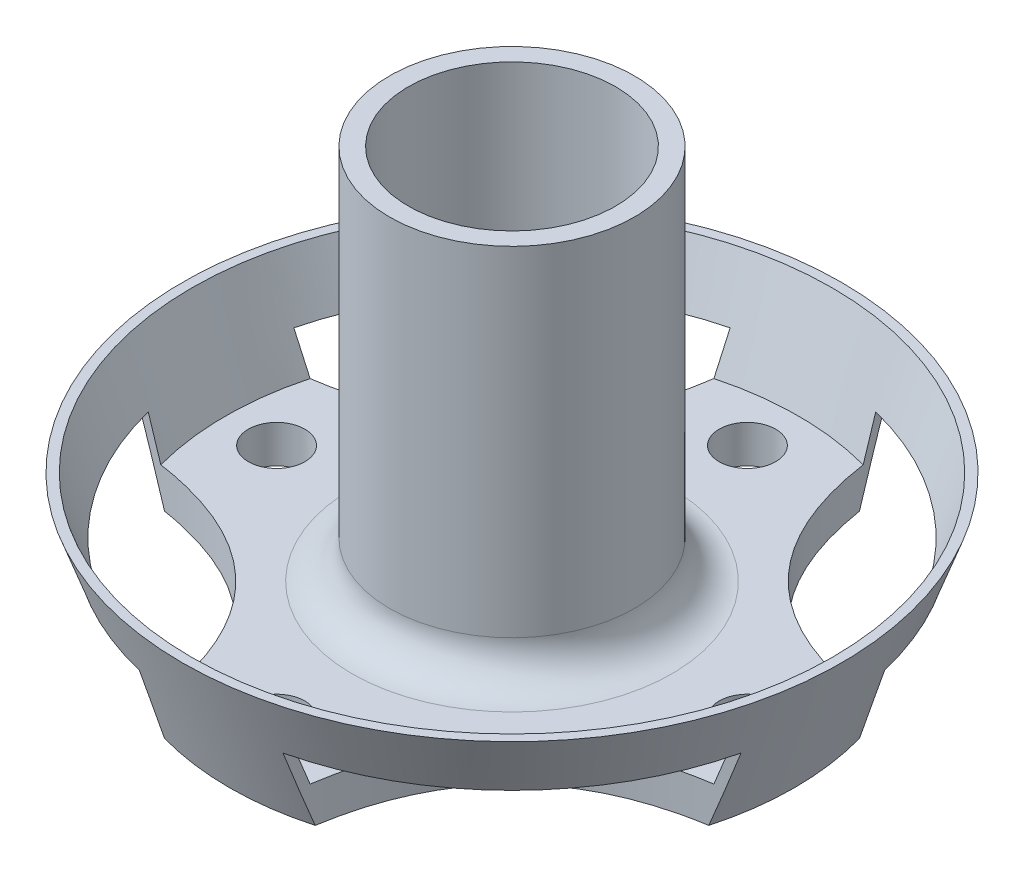
ISO-10303-21;
HEADER;
FILE_DESCRIPTION(('STEP AP214'),'2;1');
FILE_NAME('part.step','',(''),(''),'','','');
FILE_SCHEMA(('AUTOMOTIVE_DESIGN { 1 0 10303 214 1 1 1 1 }'));
ENDSEC;
DATA;
#1=APPLICATION_CONTEXT('core data for automotive mechanical design processes');
#2=APPLICATION_PROTOCOL_DEFINITION('international standard','automotive_design',2000,#1);
#3=PRODUCT_CONTEXT('',#1,'mechanical');
#4=PRODUCT('Part','Part','',(#3));
#5=PRODUCT_RELATED_PRODUCT_CATEGORY('part','',(#4));
#6=PRODUCT_DEFINITION_FORMATION('','',#4);
#7=PRODUCT_DEFINITION_CONTEXT('part definition',#1,'design');
#8=PRODUCT_DEFINITION('design','',#6,#7);
#9=PRODUCT_DEFINITION_SHAPE('','',#8);
#10=(LENGTH_UNIT() NAMED_UNIT(*) SI_UNIT(.MILLI.,.METRE.));
#11=(NAMED_UNIT(*) PLANE_ANGLE_UNIT() SI_UNIT($,.RADIAN.));
#12=(NAMED_UNIT(*) SI_UNIT($,.STERADIAN.) SOLID_ANGLE_UNIT());
#13=UNCERTAINTY_MEASURE_WITH_UNIT(LENGTH_MEASURE(1.E-05),#10,'distance_accuracy_value','');
#14=(GEOMETRIC_REPRESENTATION_CONTEXT(3) GLOBAL_UNCERTAINTY_ASSIGNED_CONTEXT((#13)) GLOBAL_UNIT_ASSIGNED_CONTEXT((#10,
#11,#12)) REPRESENTATION_CONTEXT('',''));
#15=CARTESIAN_POINT('',(0.,0.,0.));
#16=DIRECTION('',(0.,0.,1.));
#17=DIRECTION('',(1.,0.,0.));
#18=AXIS2_PLACEMENT_3D('',#15,#16,#17);
#19=CARTESIAN_POINT('',(0.,0.,0.));
#20=DIRECTION('',(0.,1.,0.));
#21=DIRECTION('',(0.,0.,1.));
#22=AXIS2_PLACEMENT_3D('',#19,#20,#21);
#23=CONICAL_SURFACE('',#22,17.5,0.343829862642884);
#24=CARTESIAN_POINT('',(14.4502302622862,-7.,4.));
#25=CARTESIAN_POINT('',(14.5363517533825,-6.77845174881383,3.98622296899141));
#26=CARTESIAN_POINT('',(14.62221347419,-6.5567631907813,3.97308695822821));
#27=CARTESIAN_POINT('',(14.7934567957451,-6.11314524514792,3.94803354015452));
#28=CARTESIAN_POINT('',(14.8788384214385,-5.89121587078824,3.93611606896538));
#29=CARTESIAN_POINT('',(15.04916804079,-5.44713793363533,3.91343512189331));
#30=CARTESIAN_POINT('',(15.1341160443688,-5.22498937599673,3.90267161949545));
#31=CARTESIAN_POINT('',(15.3036172647662,-4.7804922970567,3.88224231829451));
#32=CARTESIAN_POINT('',(15.3881704830445,-4.55814377649821,3.87257651542989));
#33=CARTESIAN_POINT('',(15.556918188404,-4.11326101691808,3.85429076300149));
#34=CARTESIAN_POINT('',(15.6411126658541,-3.89072677309978,3.84567084134774));
#35=CARTESIAN_POINT('',(15.8091733992056,-3.44548570683477,3.8294309358519));
#36=CARTESIAN_POINT('',(15.8930396392242,-3.22277887664665,3.82181099983058));
#37=CARTESIAN_POINT('',(15.9767541277314,-3.,3.81466835778894));
#38=B_SPLINE_CURVE_WITH_KNOTS('',3,(#24,#25,#26,#27,#28,#29,#30,#31,#32,#33,#34,#35,#36,#37),
.UNSPECIFIED.,.F.,.F.,(4,2,2,2,2,2,4),(0.,0.714290260718048,1.42854305747876,2.14277943922262,
2.85701317818078,3.57126597275118,4.28555291149746),.UNSPECIFIED.);
#39=CARTESIAN_POINT('',(14.4502302622826,-7.,4.00000000000057));
#40=VERTEX_POINT('',#39);
#41=CARTESIAN_POINT('',(15.9767541277313,-3.,3.81466835778894));
#42=VERTEX_POINT('',#41);
#43=EDGE_CURVE('E339',#40,#42,#38,.T.);
#44=ORIENTED_EDGE('',*,*,#43,.F.);
#45=CARTESIAN_POINT('',(0.,-7.,0.));
#46=DIRECTION('',(0.,1.,0.));
#47=DIRECTION('',(0.,0.,1.));
#48=AXIS2_PLACEMENT_3D('',#45,#46,#47);
#49=CIRCLE('',#48,14.993637138236);
#50=CARTESIAN_POINT('',(14.4502302622826,-7.,-4.00000000000057));
#51=VERTEX_POINT('',#50);
#52=EDGE_CURVE('E193',#40,#51,#49,.T.);
#53=ORIENTED_EDGE('',*,*,#52,.T.);
#54=CARTESIAN_POINT('',(14.4502302622862,-7.,-4.));
#55=CARTESIAN_POINT('',(14.5363517533825,-6.77845174881383,-3.98622296899141));
#56=CARTESIAN_POINT('',(14.62221347419,-6.5567631907813,-3.97308695822821));
#57=CARTESIAN_POINT('',(14.7934567957451,-6.11314524514792,-3.94803354015452));
#58=CARTESIAN_POINT('',(14.8788384214385,-5.89121587078824,-3.93611606896538));
#59=CARTESIAN_POINT('',(15.04916804079,-5.44713793363533,-3.91343512189331));
#60=CARTESIAN_POINT('',(15.1341160443688,-5.22498937599673,-3.90267161949545));
#61=CARTESIAN_POINT('',(15.3036172647662,-4.7804922970567,-3.88224231829451));
#62=CARTESIAN_POINT('',(15.3881704830445,-4.55814377649821,-3.87257651542989));
#63=CARTESIAN_POINT('',(15.556918188404,-4.11326101691808,-3.85429076300149));
#64=CARTESIAN_POINT('',(15.6411126658541,-3.89072677309978,-3.84567084134774));
#65=CARTESIAN_POINT('',(15.8091733992056,-3.44548570683477,-3.8294309358519));
#66=CARTESIAN_POINT('',(15.8930396392242,-3.22277887664665,-3.82181099983058));
#67=CARTESIAN_POINT('',(15.9767541277314,-3.,-3.81466835778894));
#68=B_SPLINE_CURVE_WITH_KNOTS('',3,(#54,#55,#56,#57,#58,#59,#60,#61,#62,#63,#64,#65,#66,#67),
.UNSPECIFIED.,.F.,.F.,(4,2,2,2,2,2,4),(0.,0.714290260718048,1.42854305747876,2.14277943922262,
2.85701317818078,3.57126597275118,4.28555291149746),.UNSPECIFIED.);
#69=CARTESIAN_POINT('',(15.9767541277313,-3.,-3.81466835778894));
#70=VERTEX_POINT('',#69);
#71=EDGE_CURVE('E288',#51,#70,#68,.T.);
#72=ORIENTED_EDGE('',*,*,#71,.T.);
#73=CARTESIAN_POINT('',(0.,-3.,0.));
#74=DIRECTION('',(0.,-1.,0.));
#75=DIRECTION('',(0.,0.,-1.));
#76=AXIS2_PLACEMENT_3D('',#73,#74,#75);
#77=CIRCLE('',#76,16.4258444878154);
#78=CARTESIAN_POINT('',(3.81466835778894,-3.,-15.9767541277313));
#79=VERTEX_POINT('',#78);
#80=EDGE_CURVE('E437',#70,#79,#77,.F.);
#81=ORIENTED_EDGE('',*,*,#80,.T.);
#82=CARTESIAN_POINT('',(3.81466835778894,-3.,-15.9767541277313));
#83=CARTESIAN_POINT('',(3.82181099983058,-3.22277887664664,-15.8930396392242));
#84=CARTESIAN_POINT('',(3.8294309358519,-3.44548570683477,-15.8091733992056));
#85=CARTESIAN_POINT('',(3.84567084134774,-3.89072677309978,-15.6411126658541));
#86=CARTESIAN_POINT('',(3.8542907630015,-4.11326101691808,-15.556918188404));
#87=CARTESIAN_POINT('',(3.8725765154299,-4.5581437764982,-15.3881704830445));
#88=CARTESIAN_POINT('',(3.88224231829451,-4.7804922970567,-15.3036172647662));
#89=CARTESIAN_POINT('',(3.90267161949545,-5.22498937599673,-15.1341160443688));
#90=CARTESIAN_POINT('',(3.91343512189331,-5.44713793363533,-15.04916804079));
#91=CARTESIAN_POINT('',(3.93611606896538,-5.89121587078824,-14.8788384214385));
#92=CARTESIAN_POINT('',(3.94803354015452,-6.11314524514792,-14.7934567957452));
#93=CARTESIAN_POINT('',(3.97308695822821,-6.5567631907813,-14.62221347419));
#94=CARTESIAN_POINT('',(3.98622296899141,-6.77845174881383,-14.5363517533825));
#95=CARTESIAN_POINT('',(4.,-7.,-14.4502302622862));
#96=B_SPLINE_CURVE_WITH_KNOTS('',3,(#82,#83,#84,#85,#86,#87,#88,#89,#90,#91,#92,#93,#94,#95),
.UNSPECIFIED.,.F.,.F.,(4,2,2,2,2,2,4),(0.,0.714286938746281,1.42853973331668,2.14277347227484,
2.8570098540187,3.57126265077941,4.28555291149746),.UNSPECIFIED.);
#97=CARTESIAN_POINT('',(3.99999999999997,-7.,-14.4502302622864));
#98=VERTEX_POINT('',#97);
#99=EDGE_CURVE('E220',#79,#98,#96,.T.);
#100=ORIENTED_EDGE('',*,*,#99,.T.);
#101=CARTESIAN_POINT('',(-3.99999999999997,-7.,-14.4502302622864));
#102=VERTEX_POINT('',#101);
#103=EDGE_CURVE('E200',#98,#102,#49,.T.);
#104=ORIENTED_EDGE('',*,*,#103,.T.);
#105=CARTESIAN_POINT('',(-3.81466835778894,-3.,-15.9767541277313));
#106=CARTESIAN_POINT('',(-3.82181099983058,-3.22277887664664,-15.8930396392242));
#107=CARTESIAN_POINT('',(-3.8294309358519,-3.44548570683477,-15.8091733992056));
#108=CARTESIAN_POINT('',(-3.84567084134774,-3.89072677309978,-15.6411126658541));
#109=CARTESIAN_POINT('',(-3.8542907630015,-4.11326101691808,-15.556918188404));
#110=CARTESIAN_POINT('',(-3.8725765154299,-4.5581437764982,-15.3881704830445));
#111=CARTESIAN_POINT('',(-3.88224231829451,-4.7804922970567,-15.3036172647662));
#112=CARTESIAN_POINT('',(-3.90267161949545,-5.22498937599673,-15.1341160443688));
#113=CARTESIAN_POINT('',(-3.91343512189331,-5.44713793363533,-15.04916804079));
#114=CARTESIAN_POINT('',(-3.93611606896538,-5.89121587078824,-14.8788384214385));
#115=CARTESIAN_POINT('',(-3.94803354015452,-6.11314524514792,-14.7934567957452));
#116=CARTESIAN_POINT('',(-3.97308695822821,-6.5567631907813,-14.62221347419));
#117=CARTESIAN_POINT('',(-3.98622296899141,-6.77845174881383,-14.5363517533825));
#118=CARTESIAN_POINT('',(-4.,-7.,-14.4502302622862));
#119=B_SPLINE_CURVE_WITH_KNOTS('',3,(#105,#106,#107,#108,#109,#110,#111,#112,#113,#114,#115,
#116,#117,#118),.UNSPECIFIED.,.F.,.F.,(4,2,2,2,2,2,4),(0.,0.714286938746281,1.42853973331668,
2.14277347227484,2.8570098540187,3.57126265077941,4.28555291149746),.UNSPECIFIED.);
#120=CARTESIAN_POINT('',(-3.81466835778894,-3.,-15.9767541277313));
#121=VERTEX_POINT('',#120);
#122=EDGE_CURVE('E212',#121,#102,#119,.T.);
#123=ORIENTED_EDGE('',*,*,#122,.F.);
#124=CARTESIAN_POINT('',(0.,-3.,0.));
#125=DIRECTION('',(0.,-1.,0.));
#126=DIRECTION('',(0.,0.,-1.));
#127=AXIS2_PLACEMENT_3D('',#124,#125,#126);
#128=CIRCLE('',#127,16.4258444878154);
#129=CARTESIAN_POINT('',(-15.9767541277313,-3.,-3.81466835778894));
#130=VERTEX_POINT('',#129);
#131=EDGE_CURVE('E531',#121,#130,#128,.F.);
#132=ORIENTED_EDGE('',*,*,#131,.T.);
#133=CARTESIAN_POINT('',(-14.4502302622862,-7.,-4.));
#134=CARTESIAN_POINT('',(-14.5363517533825,-6.77845174881383,-3.98622296899141));
#135=CARTESIAN_POINT('',(-14.62221347419,-6.5567631907813,-3.97308695822821));
#136=CARTESIAN_POINT('',(-14.7934567957451,-6.11314524514792,-3.94803354015452));
#137=CARTESIAN_POINT('',(-14.8788384214385,-5.89121587078824,-3.93611606896538));
#138=CARTESIAN_POINT('',(-15.04916804079,-5.44713793363533,-3.91343512189331));
#139=CARTESIAN_POINT('',(-15.1341160443688,-5.22498937599673,-3.90267161949545));
#140=CARTESIAN_POINT('',(-15.3036172647662,-4.7804922970567,-3.88224231829451));
#141=CARTESIAN_POINT('',(-15.3881704830445,-4.55814377649821,-3.87257651542989));
#142=CARTESIAN_POINT('',(-15.556918188404,-4.11326101691808,-3.85429076300149));
#143=CARTESIAN_POINT('',(-15.6411126658541,-3.89072677309978,-3.84567084134774));
#144=CARTESIAN_POINT('',(-15.8091733992056,-3.44548570683477,-3.8294309358519));
#145=CARTESIAN_POINT('',(-15.8930396392242,-3.22277887664665,-3.82181099983058));
#146=CARTESIAN_POINT('',(-15.9767541277314,-3.,-3.81466835778894));
#147=B_SPLINE_CURVE_WITH_KNOTS('',3,(#133,#134,#135,#136,#137,#138,#139,#140,#141,#142,#143,
#144,#145,#146),.UNSPECIFIED.,.F.,.F.,(4,2,2,2,2,2,4),(0.,0.714290260718048,1.42854305747876,
2.14277943922262,2.85701317818078,3.57126597275118,4.28555291149746),.UNSPECIFIED.);
#148=CARTESIAN_POINT('',(-14.4502302622826,-7.,-4.00000000000057));
#149=VERTEX_POINT('',#148);
#150=EDGE_CURVE('E322',#149,#130,#147,.T.);
#151=ORIENTED_EDGE('',*,*,#150,.F.);
#152=CARTESIAN_POINT('',(-14.4502302622826,-7.,4.00000000000057));
#153=VERTEX_POINT('',#152);
#154=EDGE_CURVE('E194',#149,#153,#49,.T.);
#155=ORIENTED_EDGE('',*,*,#154,.T.);
#156=CARTESIAN_POINT('',(-14.4502302622862,-7.,4.));
#157=CARTESIAN_POINT('',(-14.5363517533825,-6.77845174881383,3.98622296899141));
#158=CARTESIAN_POINT('',(-14.62221347419,-6.5567631907813,3.97308695822821));
#159=CARTESIAN_POINT('',(-14.7934567957451,-6.11314524514792,3.94803354015452));
#160=CARTESIAN_POINT('',(-14.8788384214385,-5.89121587078824,3.93611606896538));
#161=CARTESIAN_POINT('',(-15.04916804079,-5.44713793363533,3.91343512189331));
#162=CARTESIAN_POINT('',(-15.1341160443688,-5.22498937599673,3.90267161949545));
#163=CARTESIAN_POINT('',(-15.3036172647662,-4.7804922970567,3.88224231829451));
#164=CARTESIAN_POINT('',(-15.3881704830445,-4.55814377649821,3.87257651542989));
#165=CARTESIAN_POINT('',(-15.556918188404,-4.11326101691808,3.85429076300149));
#166=CARTESIAN_POINT('',(-15.6411126658541,-3.89072677309978,3.84567084134774));
#167=CARTESIAN_POINT('',(-15.8091733992056,-3.44548570683477,3.8294309358519));
#168=CARTESIAN_POINT('',(-15.8930396392242,-3.22277887664665,3.82181099983058));
#169=CARTESIAN_POINT('',(-15.9767541277314,-3.,3.81466835778894));
#170=B_SPLINE_CURVE_WITH_KNOTS('',3,(#156,#157,#158,#159,#160,#161,#162,#163,#164,#165,#166,
#167,#168,#169),.UNSPECIFIED.,.F.,.F.,(4,2,2,2,2,2,4),(0.,0.714290260718049,1.42854305747876,
2.14277943922262,2.85701317818078,3.57126597275118,4.28555291149746),.UNSPECIFIED.);
#171=CARTESIAN_POINT('',(-15.9767541277313,-3.,3.81466835778894));
#172=VERTEX_POINT('',#171);
#173=EDGE_CURVE('E170',#153,#172,#170,.T.);
#174=ORIENTED_EDGE('',*,*,#173,.T.);
#175=CARTESIAN_POINT('',(0.,-3.,0.));
#176=DIRECTION('',(0.,-1.,0.));
#177=DIRECTION('',(0.,0.,-1.));
#178=AXIS2_PLACEMENT_3D('',#175,#176,#177);
#179=CIRCLE('',#178,16.4258444878154);
#180=CARTESIAN_POINT('',(-3.81466835778894,-3.,15.9767541277313));
#181=VERTEX_POINT('',#180);
#182=EDGE_CURVE('E185',#172,#181,#179,.F.);
#183=ORIENTED_EDGE('',*,*,#182,.T.);
#184=CARTESIAN_POINT('',(-3.81466835778894,-3.,15.9767541277313));
#185=CARTESIAN_POINT('',(-3.82181099983058,-3.22277887664664,15.8930396392242));
#186=CARTESIAN_POINT('',(-3.8294309358519,-3.44548570683477,15.8091733992056));
#187=CARTESIAN_POINT('',(-3.84567084134774,-3.89072677309978,15.6411126658541));
#188=CARTESIAN_POINT('',(-3.8542907630015,-4.11326101691808,15.556918188404));
#189=CARTESIAN_POINT('',(-3.8725765154299,-4.5581437764982,15.3881704830445));
#190=CARTESIAN_POINT('',(-3.88224231829451,-4.7804922970567,15.3036172647662));
#191=CARTESIAN_POINT('',(-3.90267161949545,-5.22498937599673,15.1341160443688));
#192=CARTESIAN_POINT('',(-3.91343512189331,-5.44713793363533,15.04916804079));
#193=CARTESIAN_POINT('',(-3.93611606896538,-5.89121587078824,14.8788384214385));
#194=CARTESIAN_POINT('',(-3.94803354015452,-6.11314524514792,14.7934567957452));
#195=CARTESIAN_POINT('',(-3.97308695822821,-6.5567631907813,14.62221347419));
#196=CARTESIAN_POINT('',(-3.98622296899141,-6.77845174881383,14.5363517533825));
#197=CARTESIAN_POINT('',(-4.,-7.,14.4502302622862));
#198=B_SPLINE_CURVE_WITH_KNOTS('',3,(#184,#185,#186,#187,#188,#189,#190,#191,#192,#193,#194,
#195,#196,#197),.UNSPECIFIED.,.F.,.F.,(4,2,2,2,2,2,4),(0.,0.714286938746281,1.42853973331668,
2.14277347227484,2.8570098540187,3.57126265077941,4.28555291149746),.UNSPECIFIED.);
#199=CARTESIAN_POINT('',(-3.99999999999997,-7.,14.4502302622864));
#200=VERTEX_POINT('',#199);
#201=EDGE_CURVE('E161',#181,#200,#198,.T.);
#202=ORIENTED_EDGE('',*,*,#201,.T.);
#203=CARTESIAN_POINT('',(3.99999999999997,-7.,14.4502302622864));
#204=VERTEX_POINT('',#203);
#205=EDGE_CURVE('E181',#200,#204,#49,.T.);
#206=ORIENTED_EDGE('',*,*,#205,.T.);
#207=CARTESIAN_POINT('',(3.81466835778894,-3.,15.9767541277313));
#208=CARTESIAN_POINT('',(3.82181099983058,-3.22277887664664,15.8930396392242));
#209=CARTESIAN_POINT('',(3.8294309358519,-3.44548570683477,15.8091733992056));
#210=CARTESIAN_POINT('',(3.84567084134774,-3.89072677309978,15.6411126658541));
#211=CARTESIAN_POINT('',(3.8542907630015,-4.11326101691808,15.556918188404));
#212=CARTESIAN_POINT('',(3.8725765154299,-4.5581437764982,15.3881704830445));
#213=CARTESIAN_POINT('',(3.88224231829451,-4.7804922970567,15.3036172647662));
#214=CARTESIAN_POINT('',(3.90267161949545,-5.22498937599673,15.1341160443688));
#215=CARTESIAN_POINT('',(3.91343512189331,-5.44713793363533,15.04916804079));
#216=CARTESIAN_POINT('',(3.93611606896538,-5.89121587078824,14.8788384214385));
#217=CARTESIAN_POINT('',(3.94803354015452,-6.11314524514792,14.7934567957452));
#218=CARTESIAN_POINT('',(3.97308695822821,-6.5567631907813,14.62221347419));
#219=CARTESIAN_POINT('',(3.98622296899141,-6.77845174881383,14.5363517533825));
#220=CARTESIAN_POINT('',(4.,-7.,14.4502302622862));
#221=B_SPLINE_CURVE_WITH_KNOTS('',3,(#207,#208,#209,#210,#211,#212,#213,#214,#215,#216,#217,
#218,#219,#220),.UNSPECIFIED.,.F.,.F.,(4,2,2,2,2,2,4),(0.,0.714286938746281,1.42853973331668,
2.14277347227484,2.8570098540187,3.57126265077941,4.28555291149746),.UNSPECIFIED.);
#222=CARTESIAN_POINT('',(3.81466835778894,-3.,15.9767541277313));
#223=VERTEX_POINT('',#222);
#224=EDGE_CURVE('E335',#223,#204,#221,.T.);
#225=ORIENTED_EDGE('',*,*,#224,.F.);
#226=CARTESIAN_POINT('',(0.,-3.,0.));
#227=DIRECTION('',(0.,-1.,0.));
#228=DIRECTION('',(0.,0.,-1.));
#229=AXIS2_PLACEMENT_3D('',#226,#227,#228);
#230=CIRCLE('',#229,16.4258444878154);
#231=EDGE_CURVE('E523',#223,#42,#230,.F.);
#232=ORIENTED_EDGE('',*,*,#231,.T.);
#233=EDGE_LOOP('',(#44,#53,#72,#81,#100,#104,#123,#132,#151,#155,#174,#183,#202,#206,#225,#232));
#234=FACE_BOUND('',#233,.T.);
#235=CARTESIAN_POINT('',(0.,0.,0.));
#236=DIRECTION('',(0.,1.,0.));
#237=DIRECTION('',(0.,0.,1.));
#238=AXIS2_PLACEMENT_3D('',#235,#236,#237);
#239=CIRCLE('',#238,17.5);
#240=CARTESIAN_POINT('',(0.,0.,17.5));
#241=VERTEX_POINT('',#240);
#242=EDGE_CURVE('E191',#241,#241,#239,.T.);
#243=ORIENTED_EDGE('',*,*,#242,.F.);
#244=EDGE_LOOP('',(#243));
#245=FACE_BOUND('',#244,.T.);
#246=ADVANCED_FACE('F44',(#234,#245),#23,.T.);
#247=CARTESIAN_POINT('',(0.,-7.,0.));
#248=DIRECTION('',(0.,1.,0.));
#249=DIRECTION('',(0.,0.,1.));
#250=AXIS2_PLACEMENT_3D('',#247,#248,#249);
#251=PLANE('',#250);
#252=CARTESIAN_POINT('',(-12.5,-7.,0.));
#253=DIRECTION('',(0.,-1.,0.));
#254=DIRECTION('',(0.,0.,-1.));
#255=AXIS2_PLACEMENT_3D('',#252,#253,#254);
#256=CIRCLE('',#255,1.5);
#257=CARTESIAN_POINT('',(-12.5,-7.,-1.5));
#258=VERTEX_POINT('',#257);
#259=EDGE_CURVE('E464',#258,#258,#256,.T.);
#260=ORIENTED_EDGE('',*,*,#259,.F.);
#261=EDGE_LOOP('',(#260));
#262=FACE_BOUND('',#261,.T.);
#263=CARTESIAN_POINT('',(0.,-7.,12.5));
#264=DIRECTION('',(0.,-1.,0.));
#265=DIRECTION('',(0.,0.,-1.));
#266=AXIS2_PLACEMENT_3D('',#263,#264,#265);
#267=CIRCLE('',#266,1.5);
#268=CARTESIAN_POINT('',(0.,-7.,11.));
#269=VERTEX_POINT('',#268);
#270=EDGE_CURVE('E546',#269,#269,#267,.T.);
#271=ORIENTED_EDGE('',*,*,#270,.F.);
#272=EDGE_LOOP('',(#271));
#273=FACE_BOUND('',#272,.T.);
#274=CARTESIAN_POINT('',(12.5,-7.,0.));
#275=DIRECTION('',(0.,-1.,0.));
#276=DIRECTION('',(0.,0.,-1.));
#277=AXIS2_PLACEMENT_3D('',#274,#275,#276);
#278=CIRCLE('',#277,1.5);
#279=CARTESIAN_POINT('',(12.5,-7.,-1.5));
#280=VERTEX_POINT('',#279);
#281=EDGE_CURVE('E549',#280,#280,#278,.T.);
#282=ORIENTED_EDGE('',*,*,#281,.F.);
#283=EDGE_LOOP('',(#282));
#284=FACE_BOUND('',#283,.T.);
#285=CARTESIAN_POINT('',(0.,-7.,-12.5));
#286=DIRECTION('',(0.,-1.,0.));
#287=DIRECTION('',(0.,0.,-1.));
#288=AXIS2_PLACEMENT_3D('',#285,#286,#287);
#289=CIRCLE('',#288,1.5);
#290=CARTESIAN_POINT('',(0.,-7.,-14.));
#291=VERTEX_POINT('',#290);
#292=EDGE_CURVE('E555',#291,#291,#289,.T.);
#293=ORIENTED_EDGE('',*,*,#292,.F.);
#294=EDGE_LOOP('',(#293));
#295=FACE_BOUND('',#294,.T.);
#296=CARTESIAN_POINT('',(0.,-7.,0.));
#297=DIRECTION('',(0.,-1.,0.));
#298=DIRECTION('',(0.,0.,-1.));
#299=AXIS2_PLACEMENT_3D('',#296,#297,#298);
#300=CIRCLE('',#299,5.5);
#301=CARTESIAN_POINT('',(0.,-7.,-5.5));
#302=VERTEX_POINT('',#301);
#303=EDGE_CURVE('E375',#302,#302,#300,.T.);
#304=ORIENTED_EDGE('',*,*,#303,.F.);
#305=EDGE_LOOP('',(#304));
#306=FACE_BOUND('',#305,.T.);
#307=CARTESIAN_POINT('',(3.74578755544739,-7.,17.0944165033339));
#308=CARTESIAN_POINT('',(4.2463071276076,-7.,4.24630712760761));
#309=CARTESIAN_POINT('',(17.0944165033339,-7.,3.74578755544738));
#310=B_SPLINE_CURVE_WITH_KNOTS('',2,(#307,#308,#309),.UNSPECIFIED.,.F.,.F.,(3,3),(0.,1.),.UNSPECIFIED.);
#311=EDGE_CURVE('E186',#204,#40,#310,.T.);
#312=ORIENTED_EDGE('',*,*,#311,.F.);
#313=ORIENTED_EDGE('',*,*,#205,.F.);
#314=CARTESIAN_POINT('',(-3.74578755544739,-7.,17.0944165033339));
#315=CARTESIAN_POINT('',(-4.2463071276076,-7.,4.24630712760761));
#316=CARTESIAN_POINT('',(-17.0944165033339,-7.,3.74578755544738));
#317=B_SPLINE_CURVE_WITH_KNOTS('',2,(#314,#315,#316),.UNSPECIFIED.,.F.,.F.,(3,3),(0.,1.),.UNSPECIFIED.);
#318=EDGE_CURVE('E158',#200,#153,#317,.T.);
#319=ORIENTED_EDGE('',*,*,#318,.T.);
#320=ORIENTED_EDGE('',*,*,#154,.F.);
#321=CARTESIAN_POINT('',(-3.74578755544739,-7.,-17.0944165033339));
#322=CARTESIAN_POINT('',(-4.2463071276076,-7.,-4.24630712760761));
#323=CARTESIAN_POINT('',(-17.0944165033339,-7.,-3.74578755544738));
#324=B_SPLINE_CURVE_WITH_KNOTS('',2,(#321,#322,#323),.UNSPECIFIED.,.F.,.F.,(3,3),(0.,1.),.UNSPECIFIED.);
#325=EDGE_CURVE('E221',#102,#149,#324,.T.);
#326=ORIENTED_EDGE('',*,*,#325,.F.);
#327=ORIENTED_EDGE('',*,*,#103,.F.);
#328=CARTESIAN_POINT('',(3.74578755544739,-7.,-17.0944165033339));
#329=CARTESIAN_POINT('',(4.2463071276076,-7.,-4.24630712760761));
#330=CARTESIAN_POINT('',(17.0944165033339,-7.,-3.74578755544738));
#331=B_SPLINE_CURVE_WITH_KNOTS('',2,(#328,#329,#330),.UNSPECIFIED.,.F.,.F.,(3,3),(0.,1.),.UNSPECIFIED.);
#332=EDGE_CURVE('E218',#98,#51,#331,.T.);
#333=ORIENTED_EDGE('',*,*,#332,.T.);
#334=ORIENTED_EDGE('',*,*,#52,.F.);
#335=EDGE_LOOP('',(#312,#313,#319,#320,#326,#327,#333,#334));
#336=FACE_BOUND('',#335,.T.);
#337=ADVANCED_FACE('F190',(#262,#273,#284,#295,#306,#336),#251,.F.);
#338=CARTESIAN_POINT('',(0.,0.,0.));
#339=DIRECTION('',(0.,1.,0.));
#340=DIRECTION('',(0.,0.,1.));
#341=AXIS2_PLACEMENT_3D('',#338,#339,#340);
#342=CONICAL_SURFACE('',#341,17.,0.343829862642884);
#343=CARTESIAN_POINT('',(0.,-5.,0.));
#344=DIRECTION('',(0.,1.,0.));
#345=DIRECTION('',(0.,0.,1.));
#346=AXIS2_PLACEMENT_3D('',#343,#344,#345);
#347=CIRCLE('',#346,15.2097408130257);
#348=CARTESIAN_POINT('',(14.6840911671301,-5.,3.96404871246978));
#349=VERTEX_POINT('',#348);
#350=CARTESIAN_POINT('',(14.6840911671271,-5.,-3.96404871246898));
#351=VERTEX_POINT('',#350);
#352=EDGE_CURVE('E196',#349,#351,#347,.T.);
#353=ORIENTED_EDGE('',*,*,#352,.F.);
#354=CARTESIAN_POINT('',(14.6840911671304,-5.,3.96404871246849));
#355=CARTESIAN_POINT('',(14.7483677576832,-4.8335886137216,3.95456558985454));
#356=CARTESIAN_POINT('',(14.8125099997946,-4.66710589560705,3.94542615524612));
#357=CARTESIAN_POINT('',(14.9405420773175,-4.33401126478599,3.92780928189622));
#358=CARTESIAN_POINT('',(15.0044319164792,-4.16739935404343,3.91933183328322));
#359=CARTESIAN_POINT('',(15.131977374195,-3.83405489574011,3.90301327303525));
#360=CARTESIAN_POINT('',(15.195632992824,-3.66732234821798,3.89517216119659));
#361=CARTESIAN_POINT('',(15.3227259525316,-3.33374350665749,3.88010337825631));
#362=CARTESIAN_POINT('',(15.3861632903405,-3.16689721095968,3.87287571630595));
#363=CARTESIAN_POINT('',(15.4494984998934,-3.0000000000002,3.86594344912986));
#364=B_SPLINE_CURVE_WITH_KNOTS('',3,(#354,#355,#356,#357,#358,#359,#360,#361,#362,#363),
.UNSPECIFIED.,.F.,.F.,(4,2,2,2,4),(0.,0.535935442902525,1.07186289241163,1.60779017038091,
2.14372544174616),.UNSPECIFIED.);
#365=CARTESIAN_POINT('',(15.4494984998929,-3.,3.86594344912991));
#366=VERTEX_POINT('',#365);
#367=EDGE_CURVE('E338',#349,#366,#364,.T.);
#368=ORIENTED_EDGE('',*,*,#367,.T.);
#369=CARTESIAN_POINT('',(0.,-3.,0.));
#370=DIRECTION('',(0.,-1.,0.));
#371=DIRECTION('',(0.,0.,-1.));
#372=AXIS2_PLACEMENT_3D('',#369,#370,#371);
#373=CIRCLE('',#372,15.9258444878154);
#374=CARTESIAN_POINT('',(3.86594344912985,-3.,15.4494984998935));
#375=VERTEX_POINT('',#374);
#376=EDGE_CURVE('E448',#375,#366,#373,.F.);
#377=ORIENTED_EDGE('',*,*,#376,.F.);
#378=CARTESIAN_POINT('',(3.86594344912985,-3.,15.4494984998935));
#379=CARTESIAN_POINT('',(3.87287571630594,-3.16689721095949,15.3861632903405));
#380=CARTESIAN_POINT('',(3.88010337825631,-3.33374350665732,15.3227259525317));
#381=CARTESIAN_POINT('',(3.89517216119659,-3.66732234821785,15.195632992824));
#382=CARTESIAN_POINT('',(3.90301327303524,-3.83405489573999,15.1319773741951));
#383=CARTESIAN_POINT('',(3.91933183328322,-4.16739935404334,15.0044319164793));
#384=CARTESIAN_POINT('',(3.92780928189622,-4.33401126478592,14.9405420773175));
#385=CARTESIAN_POINT('',(3.94542615524611,-4.66710589560702,14.8125099997946));
#386=CARTESIAN_POINT('',(3.95456558985454,-4.83358861372158,14.7483677576832));
#387=CARTESIAN_POINT('',(3.9640487124685,-5.,14.6840911671304));
#388=B_SPLINE_CURVE_WITH_KNOTS('',3,(#378,#379,#380,#381,#382,#383,#384,#385,#386,#387),
.UNSPECIFIED.,.F.,.F.,(4,2,2,2,4),(0.,0.535935271365306,1.07186254933464,1.6077899988438,
2.14372544174638),.UNSPECIFIED.);
#389=CARTESIAN_POINT('',(3.9640487124685,-5.,14.6840911671304));
#390=VERTEX_POINT('',#389);
#391=EDGE_CURVE('E428',#375,#390,#388,.T.);
#392=ORIENTED_EDGE('',*,*,#391,.T.);
#393=CARTESIAN_POINT('',(-3.9640487124685,-5.,14.6840911671304));
#394=VERTEX_POINT('',#393);
#395=EDGE_CURVE('E507',#394,#390,#347,.T.);
#396=ORIENTED_EDGE('',*,*,#395,.F.);
#397=CARTESIAN_POINT('',(-3.86594344912985,-3.,15.4494984998935));
#398=CARTESIAN_POINT('',(-3.87287571630594,-3.16689721095949,15.3861632903405));
#399=CARTESIAN_POINT('',(-3.88010337825631,-3.33374350665732,15.3227259525317));
#400=CARTESIAN_POINT('',(-3.89517216119659,-3.66732234821785,15.195632992824));
#401=CARTESIAN_POINT('',(-3.90301327303524,-3.83405489573999,15.1319773741951));
#402=CARTESIAN_POINT('',(-3.91933183328322,-4.16739935404335,15.0044319164793));
#403=CARTESIAN_POINT('',(-3.92780928189622,-4.33401126478592,14.9405420773175));
#404=CARTESIAN_POINT('',(-3.94542615524611,-4.66710589560702,14.8125099997946));
#405=CARTESIAN_POINT('',(-3.95456558985454,-4.83358861372158,14.7483677576832));
#406=CARTESIAN_POINT('',(-3.9640487124685,-5.,14.6840911671304));
#407=B_SPLINE_CURVE_WITH_KNOTS('',3,(#397,#398,#399,#400,#401,#402,#403,#404,#405,#406),
.UNSPECIFIED.,.F.,.F.,(4,2,2,2,4),(0.,0.535935271365306,1.07186254933464,1.6077899988438,
2.14372544174638),.UNSPECIFIED.);
#408=CARTESIAN_POINT('',(-3.86594344912985,-3.,15.4494984998935));
#409=VERTEX_POINT('',#408);
#410=EDGE_CURVE('E391',#409,#394,#407,.T.);
#411=ORIENTED_EDGE('',*,*,#410,.F.);
#412=CARTESIAN_POINT('',(0.,-3.,0.));
#413=DIRECTION('',(0.,-1.,0.));
#414=DIRECTION('',(0.,0.,-1.));
#415=AXIS2_PLACEMENT_3D('',#412,#413,#414);
#416=CIRCLE('',#415,15.9258444878154);
#417=CARTESIAN_POINT('',(-15.4494984998929,-3.,3.86594344912991));
#418=VERTEX_POINT('',#417);
#419=EDGE_CURVE('E457',#418,#409,#416,.F.);
#420=ORIENTED_EDGE('',*,*,#419,.F.);
#421=CARTESIAN_POINT('',(-14.6840911671304,-5.,3.96404871246849));
#422=CARTESIAN_POINT('',(-14.7483677576832,-4.8335886137216,3.95456558985454));
#423=CARTESIAN_POINT('',(-14.8125099997946,-4.66710589560705,3.94542615524611));
#424=CARTESIAN_POINT('',(-14.9405420773175,-4.33401126478599,3.92780928189622));
#425=CARTESIAN_POINT('',(-15.0044319164792,-4.16739935404343,3.91933183328322));
#426=CARTESIAN_POINT('',(-15.131977374195,-3.83405489574011,3.90301327303525));
#427=CARTESIAN_POINT('',(-15.195632992824,-3.66732234821798,3.89517216119659));
#428=CARTESIAN_POINT('',(-15.3227259525316,-3.33374350665749,3.88010337825631));
#429=CARTESIAN_POINT('',(-15.3861632903405,-3.16689721095968,3.87287571630595));
#430=CARTESIAN_POINT('',(-15.4494984998934,-3.0000000000002,3.86594344912986));
#431=B_SPLINE_CURVE_WITH_KNOTS('',3,(#421,#422,#423,#424,#425,#426,#427,#428,#429,#430),
.UNSPECIFIED.,.F.,.F.,(4,2,2,2,4),(0.,0.535935442902524,1.07186289241163,1.60779017038091,
2.14372544174616),.UNSPECIFIED.);
#432=CARTESIAN_POINT('',(-14.6840911671271,-5.,3.96404871246898));
#433=VERTEX_POINT('',#432);
#434=EDGE_CURVE('E183',#433,#418,#431,.T.);
#435=ORIENTED_EDGE('',*,*,#434,.F.);
#436=CARTESIAN_POINT('',(-14.6840911671301,-5.,-3.96404871246978));
#437=VERTEX_POINT('',#436);
#438=EDGE_CURVE('E516',#437,#433,#347,.T.);
#439=ORIENTED_EDGE('',*,*,#438,.F.);
#440=CARTESIAN_POINT('',(-14.6840911671304,-5.,-3.96404871246849));
#441=CARTESIAN_POINT('',(-14.7483677576832,-4.83358861372159,-3.95456558985454));
#442=CARTESIAN_POINT('',(-14.8125099997946,-4.66710589560705,-3.94542615524612));
#443=CARTESIAN_POINT('',(-14.9405420773175,-4.33401126478599,-3.92780928189622));
#444=CARTESIAN_POINT('',(-15.0044319164792,-4.16739935404343,-3.91933183328322));
#445=CARTESIAN_POINT('',(-15.131977374195,-3.83405489574011,-3.90301327303525));
#446=CARTESIAN_POINT('',(-15.195632992824,-3.66732234821798,-3.89517216119659));
#447=CARTESIAN_POINT('',(-15.3227259525316,-3.33374350665749,-3.88010337825631));
#448=CARTESIAN_POINT('',(-15.3861632903404,-3.16689721095967,-3.87287571630595));
#449=CARTESIAN_POINT('',(-15.4494984998934,-3.0000000000002,-3.86594344912986));
#450=B_SPLINE_CURVE_WITH_KNOTS('',3,(#440,#441,#442,#443,#444,#445,#446,#447,#448,#449),
.UNSPECIFIED.,.F.,.F.,(4,2,2,2,4),(0.,0.535935442902524,1.07186289241163,1.60779017038091,
2.14372544174616),.UNSPECIFIED.);
#451=CARTESIAN_POINT('',(-15.4494984998929,-3.,-3.86594344912991));
#452=VERTEX_POINT('',#451);
#453=EDGE_CURVE('E419',#437,#452,#450,.T.);
#454=ORIENTED_EDGE('',*,*,#453,.T.);
#455=CARTESIAN_POINT('',(0.,-3.,0.));
#456=DIRECTION('',(0.,-1.,0.));
#457=DIRECTION('',(0.,0.,-1.));
#458=AXIS2_PLACEMENT_3D('',#455,#456,#457);
#459=CIRCLE('',#458,15.9258444878154);
#460=CARTESIAN_POINT('',(-3.86594344912985,-3.,-15.4494984998935));
#461=VERTEX_POINT('',#460);
#462=EDGE_CURVE('E454',#461,#452,#459,.F.);
#463=ORIENTED_EDGE('',*,*,#462,.F.);
#464=CARTESIAN_POINT('',(-3.86594344912985,-3.,-15.4494984998935));
#465=CARTESIAN_POINT('',(-3.87287571630594,-3.16689721095949,-15.3861632903405));
#466=CARTESIAN_POINT('',(-3.88010337825631,-3.33374350665732,-15.3227259525317));
#467=CARTESIAN_POINT('',(-3.89517216119659,-3.66732234821785,-15.195632992824));
#468=CARTESIAN_POINT('',(-3.90301327303524,-3.83405489573999,-15.1319773741951));
#469=CARTESIAN_POINT('',(-3.91933183328322,-4.16739935404335,-15.0044319164793));
#470=CARTESIAN_POINT('',(-3.92780928189622,-4.33401126478592,-14.9405420773175));
#471=CARTESIAN_POINT('',(-3.94542615524611,-4.66710589560702,-14.8125099997946));
#472=CARTESIAN_POINT('',(-3.95456558985454,-4.83358861372158,-14.7483677576832));
#473=CARTESIAN_POINT('',(-3.9640487124685,-5.,-14.6840911671304));
#474=B_SPLINE_CURVE_WITH_KNOTS('',3,(#464,#465,#466,#467,#468,#469,#470,#471,#472,#473),
.UNSPECIFIED.,.F.,.F.,(4,2,2,2,4),(0.,0.535935271365306,1.07186254933464,1.6077899988438,
2.14372544174638),.UNSPECIFIED.);
#475=CARTESIAN_POINT('',(-3.9640487124685,-5.,-14.6840911671304));
#476=VERTEX_POINT('',#475);
#477=EDGE_CURVE('E411',#461,#476,#474,.T.);
#478=ORIENTED_EDGE('',*,*,#477,.T.);
#479=CARTESIAN_POINT('',(3.9640487124685,-5.,-14.6840911671304));
#480=VERTEX_POINT('',#479);
#481=EDGE_CURVE('E514',#480,#476,#347,.T.);
#482=ORIENTED_EDGE('',*,*,#481,.F.);
#483=CARTESIAN_POINT('',(3.86594344912985,-3.,-15.4494984998935));
#484=CARTESIAN_POINT('',(3.87287571630594,-3.16689721095949,-15.3861632903405));
#485=CARTESIAN_POINT('',(3.88010337825631,-3.33374350665732,-15.3227259525317));
#486=CARTESIAN_POINT('',(3.89517216119659,-3.66732234821785,-15.195632992824));
#487=CARTESIAN_POINT('',(3.90301327303524,-3.83405489573999,-15.1319773741951));
#488=CARTESIAN_POINT('',(3.91933183328322,-4.16739935404335,-15.0044319164793));
#489=CARTESIAN_POINT('',(3.92780928189622,-4.33401126478592,-14.9405420773175));
#490=CARTESIAN_POINT('',(3.94542615524611,-4.66710589560702,-14.8125099997946));
#491=CARTESIAN_POINT('',(3.95456558985454,-4.83358861372158,-14.7483677576832));
#492=CARTESIAN_POINT('',(3.9640487124685,-5.,-14.6840911671304));
#493=B_SPLINE_CURVE_WITH_KNOTS('',3,(#483,#484,#485,#486,#487,#488,#489,#490,#491,#492),
.UNSPECIFIED.,.F.,.F.,(4,2,2,2,4),(0.,0.535935271365306,1.07186254933464,1.6077899988438,
2.14372544174638),.UNSPECIFIED.);
#494=CARTESIAN_POINT('',(3.86594344912985,-3.,-15.4494984998935));
#495=VERTEX_POINT('',#494);
#496=EDGE_CURVE('E267',#495,#480,#493,.T.);
#497=ORIENTED_EDGE('',*,*,#496,.F.);
#498=CARTESIAN_POINT('',(0.,-3.,0.));
#499=DIRECTION('',(0.,-1.,0.));
#500=DIRECTION('',(0.,0.,-1.));
#501=AXIS2_PLACEMENT_3D('',#498,#499,#500);
#502=CIRCLE('',#501,15.9258444878154);
#503=CARTESIAN_POINT('',(15.4494984998929,-3.,-3.86594344912991));
#504=VERTEX_POINT('',#503);
#505=EDGE_CURVE('E442',#504,#495,#502,.F.);
#506=ORIENTED_EDGE('',*,*,#505,.F.);
#507=CARTESIAN_POINT('',(14.6840911671304,-5.,-3.96404871246849));
#508=CARTESIAN_POINT('',(14.7483677576832,-4.83358861372159,-3.95456558985454));
#509=CARTESIAN_POINT('',(14.8125099997946,-4.66710589560705,-3.94542615524612));
#510=CARTESIAN_POINT('',(14.9405420773175,-4.33401126478599,-3.92780928189622));
#511=CARTESIAN_POINT('',(15.0044319164792,-4.16739935404343,-3.91933183328322));
#512=CARTESIAN_POINT('',(15.131977374195,-3.83405489574011,-3.90301327303525));
#513=CARTESIAN_POINT('',(15.195632992824,-3.66732234821798,-3.89517216119659));
#514=CARTESIAN_POINT('',(15.3227259525316,-3.33374350665749,-3.88010337825631));
#515=CARTESIAN_POINT('',(15.3861632903404,-3.16689721095967,-3.87287571630595));
#516=CARTESIAN_POINT('',(15.4494984998934,-3.0000000000002,-3.86594344912986));
#517=B_SPLINE_CURVE_WITH_KNOTS('',3,(#507,#508,#509,#510,#511,#512,#513,#514,#515,#516),
.UNSPECIFIED.,.F.,.F.,(4,2,2,2,4),(0.,0.535935442902524,1.07186289241163,1.60779017038091,
2.14372544174616),.UNSPECIFIED.);
#518=EDGE_CURVE('E280',#351,#504,#517,.T.);
#519=ORIENTED_EDGE('',*,*,#518,.F.);
#520=EDGE_LOOP('',(#353,#368,#377,#392,#396,#411,#420,#435,#439,#454,#463,#478,#482,#497,#506,#519));
#521=FACE_BOUND('',#520,.T.);
#522=CARTESIAN_POINT('',(0.,0.,0.));
#523=DIRECTION('',(0.,1.,0.));
#524=DIRECTION('',(0.,0.,1.));
#525=AXIS2_PLACEMENT_3D('',#522,#523,#524);
#526=CIRCLE('',#525,17.);
#527=CARTESIAN_POINT('',(0.,0.,17.));
#528=VERTEX_POINT('',#527);
#529=EDGE_CURVE('E517',#528,#528,#526,.T.);
#530=ORIENTED_EDGE('',*,*,#529,.T.);
#531=EDGE_LOOP('',(#530));
#532=FACE_BOUND('',#531,.T.);
#533=ADVANCED_FACE('F403',(#521,#532),#342,.F.);
#534=CARTESIAN_POINT('',(0.,-5.,0.));
#535=DIRECTION('',(0.,1.,0.));
#536=DIRECTION('',(0.,0.,1.));
#537=AXIS2_PLACEMENT_3D('',#534,#535,#536);
#538=PLANE('',#537);
#539=CARTESIAN_POINT('',(0.,-5.,0.));
#540=DIRECTION('',(0.,1.,0.));
#541=DIRECTION('',(0.,0.,1.));
#542=AXIS2_PLACEMENT_3D('',#539,#540,#541);
#543=CIRCLE('',#542,8.5);
#544=CARTESIAN_POINT('',(0.,-5.,8.5));
#545=VERTEX_POINT('',#544);
#546=EDGE_CURVE('E11',#545,#545,#543,.F.);
#547=ORIENTED_EDGE('',*,*,#546,.T.);
#548=EDGE_LOOP('',(#547));
#549=FACE_BOUND('',#548,.T.);
#550=CARTESIAN_POINT('',(-12.5,-5.,0.));
#551=DIRECTION('',(0.,1.,0.));
#552=DIRECTION('',(0.,0.,1.));
#553=AXIS2_PLACEMENT_3D('',#550,#551,#552);
#554=CIRCLE('',#553,1.5);
#555=CARTESIAN_POINT('',(-12.5,-5.,1.5));
#556=VERTEX_POINT('',#555);
#557=EDGE_CURVE('E475',#556,#556,#554,.T.);
#558=ORIENTED_EDGE('',*,*,#557,.F.);
#559=EDGE_LOOP('',(#558));
#560=FACE_BOUND('',#559,.T.);
#561=CARTESIAN_POINT('',(0.,-5.,12.5));
#562=DIRECTION('',(0.,1.,0.));
#563=DIRECTION('',(0.,0.,1.));
#564=AXIS2_PLACEMENT_3D('',#561,#562,#563);
#565=CIRCLE('',#564,1.5);
#566=CARTESIAN_POINT('',(0.,-5.,14.));
#567=VERTEX_POINT('',#566);
#568=EDGE_CURVE('E469',#567,#567,#565,.T.);
#569=ORIENTED_EDGE('',*,*,#568,.F.);
#570=EDGE_LOOP('',(#569));
#571=FACE_BOUND('',#570,.T.);
#572=CARTESIAN_POINT('',(12.5,-5.,0.));
#573=DIRECTION('',(0.,1.,0.));
#574=DIRECTION('',(0.,0.,1.));
#575=AXIS2_PLACEMENT_3D('',#572,#573,#574);
#576=CIRCLE('',#575,1.5);
#577=CARTESIAN_POINT('',(12.5,-5.,1.5));
#578=VERTEX_POINT('',#577);
#579=EDGE_CURVE('E463',#578,#578,#576,.T.);
#580=ORIENTED_EDGE('',*,*,#579,.F.);
#581=EDGE_LOOP('',(#580));
#582=FACE_BOUND('',#581,.T.);
#583=CARTESIAN_POINT('',(0.,-5.,-12.5));
#584=DIRECTION('',(0.,1.,0.));
#585=DIRECTION('',(0.,0.,1.));
#586=AXIS2_PLACEMENT_3D('',#583,#584,#585);
#587=CIRCLE('',#586,1.5);
#588=CARTESIAN_POINT('',(0.,-5.,-11.));
#589=VERTEX_POINT('',#588);
#590=EDGE_CURVE('E458',#589,#589,#587,.T.);
#591=ORIENTED_EDGE('',*,*,#590,.F.);
#592=EDGE_LOOP('',(#591));
#593=FACE_BOUND('',#592,.T.);
#594=CARTESIAN_POINT('',(3.74578755544739,-5.,17.0944165033339));
#595=CARTESIAN_POINT('',(4.2463071276076,-5.,4.24630712760761));
#596=CARTESIAN_POINT('',(17.0944165033339,-5.,3.74578755544738));
#597=B_SPLINE_CURVE_WITH_KNOTS('',2,(#594,#595,#596),.UNSPECIFIED.,.F.,.F.,(3,3),(0.,1.),.UNSPECIFIED.);
#598=EDGE_CURVE('E506',#349,#390,#597,.F.);
#599=ORIENTED_EDGE('',*,*,#598,.F.);
#600=ORIENTED_EDGE('',*,*,#352,.T.);
#601=CARTESIAN_POINT('',(3.74578755544739,-5.,-17.0944165033339));
#602=CARTESIAN_POINT('',(4.2463071276076,-5.,-4.24630712760761));
#603=CARTESIAN_POINT('',(17.0944165033339,-5.,-3.74578755544738));
#604=B_SPLINE_CURVE_WITH_KNOTS('',2,(#601,#602,#603),.UNSPECIFIED.,.F.,.F.,(3,3),(0.,1.),.UNSPECIFIED.);
#605=EDGE_CURVE('E509',#351,#480,#604,.F.);
#606=ORIENTED_EDGE('',*,*,#605,.T.);
#607=ORIENTED_EDGE('',*,*,#481,.T.);
#608=CARTESIAN_POINT('',(-3.74578755544739,-5.,-17.0944165033339));
#609=CARTESIAN_POINT('',(-4.2463071276076,-5.,-4.24630712760761));
#610=CARTESIAN_POINT('',(-17.0944165033339,-5.,-3.74578755544738));
#611=B_SPLINE_CURVE_WITH_KNOTS('',2,(#608,#609,#610),.UNSPECIFIED.,.F.,.F.,(3,3),(0.,1.),.UNSPECIFIED.);
#612=EDGE_CURVE('E209',#437,#476,#611,.F.);
#613=ORIENTED_EDGE('',*,*,#612,.F.);
#614=ORIENTED_EDGE('',*,*,#438,.T.);
#615=CARTESIAN_POINT('',(-3.74578755544739,-5.,17.0944165033339));
#616=CARTESIAN_POINT('',(-4.2463071276076,-5.,4.24630712760761));
#617=CARTESIAN_POINT('',(-17.0944165033339,-5.,3.74578755544738));
#618=B_SPLINE_CURVE_WITH_KNOTS('',2,(#615,#616,#617),.UNSPECIFIED.,.F.,.F.,(3,3),(0.,1.),.UNSPECIFIED.);
#619=EDGE_CURVE('E203',#433,#394,#618,.F.);
#620=ORIENTED_EDGE('',*,*,#619,.T.);
#621=ORIENTED_EDGE('',*,*,#395,.T.);
#622=EDGE_LOOP('',(#599,#600,#606,#607,#613,#614,#620,#621));
#623=FACE_BOUND('',#622,.T.);
#624=ADVANCED_FACE('F392',(#549,#560,#571,#582,#593,#623),#538,.T.);
#625=CARTESIAN_POINT('',(0.,0.,0.));
#626=DIRECTION('',(0.,1.,0.));
#627=DIRECTION('',(0.,0.,1.));
#628=AXIS2_PLACEMENT_3D('',#625,#626,#627);
#629=PLANE('',#628);
#630=ORIENTED_EDGE('',*,*,#529,.F.);
#631=EDGE_LOOP('',(#630));
#632=FACE_BOUND('',#631,.T.);
#633=ORIENTED_EDGE('',*,*,#242,.T.);
#634=EDGE_LOOP('',(#633));
#635=FACE_BOUND('',#634,.T.);
#636=ADVANCED_FACE('F296',(#632,#635),#629,.T.);
#637=CARTESIAN_POINT('',(0.,-3.,0.));
#638=DIRECTION('',(0.,-1.,0.));
#639=DIRECTION('',(0.,0.,-1.));
#640=AXIS2_PLACEMENT_3D('',#637,#638,#639);
#641=PLANE('',#640);
#642=CARTESIAN_POINT('',(-3.74578755544739,-3.,17.0944165033339));
#643=CARTESIAN_POINT('',(-4.2463071276076,-3.,4.24630712760761));
#644=CARTESIAN_POINT('',(-17.0944165033339,-3.,3.74578755544738));
#645=B_SPLINE_CURVE_WITH_KNOTS('',2,(#642,#643,#644),.UNSPECIFIED.,.F.,.F.,(3,3),(0.,1.),.UNSPECIFIED.);
#646=EDGE_CURVE('E173',#418,#172,#645,.T.);
#647=ORIENTED_EDGE('',*,*,#646,.F.);
#648=ORIENTED_EDGE('',*,*,#419,.T.);
#649=EDGE_CURVE('E379',#181,#409,#645,.T.);
#650=ORIENTED_EDGE('',*,*,#649,.F.);
#651=ORIENTED_EDGE('',*,*,#182,.F.);
#652=EDGE_LOOP('',(#647,#648,#650,#651));
#653=FACE_BOUND('',#652,.T.);
#654=ADVANCED_FACE('F358',(#653),#641,.T.);
#655=DIRECTION('',(0.,-1.,0.));
#656=VECTOR('',#655,1.);
#657=SURFACE_OF_LINEAR_EXTRUSION('',#645,#656);
#658=ORIENTED_EDGE('',*,*,#318,.F.);
#659=ORIENTED_EDGE('',*,*,#201,.F.);
#660=ORIENTED_EDGE('',*,*,#649,.T.);
#661=ORIENTED_EDGE('',*,*,#410,.T.);
#662=ORIENTED_EDGE('',*,*,#619,.F.);
#663=ORIENTED_EDGE('',*,*,#434,.T.);
#664=ORIENTED_EDGE('',*,*,#646,.T.);
#665=ORIENTED_EDGE('',*,*,#173,.F.);
#666=EDGE_LOOP('',(#658,#659,#660,#661,#662,#663,#664,#665));
#667=FACE_BOUND('',#666,.T.);
#668=ADVANCED_FACE('F163',(#667),#657,.T.);
#669=CARTESIAN_POINT('',(0.,-3.,0.));
#670=DIRECTION('',(0.,-1.,0.));
#671=DIRECTION('',(0.,0.,-1.));
#672=AXIS2_PLACEMENT_3D('',#669,#670,#671);
#673=PLANE('',#672);
#674=CARTESIAN_POINT('',(-3.74578755544739,-3.,-17.0944165033339));
#675=CARTESIAN_POINT('',(-4.2463071276076,-3.,-4.24630712760761));
#676=CARTESIAN_POINT('',(-17.0944165033339,-3.,-3.74578755544738));
#677=B_SPLINE_CURVE_WITH_KNOTS('',2,(#674,#675,#676),.UNSPECIFIED.,.F.,.F.,(3,3),(0.,1.),.UNSPECIFIED.);
#678=EDGE_CURVE('E172',#121,#461,#677,.T.);
#679=ORIENTED_EDGE('',*,*,#678,.T.);
#680=ORIENTED_EDGE('',*,*,#462,.T.);
#681=EDGE_CURVE('E228',#452,#130,#677,.T.);
#682=ORIENTED_EDGE('',*,*,#681,.T.);
#683=ORIENTED_EDGE('',*,*,#131,.F.);
#684=EDGE_LOOP('',(#679,#680,#682,#683));
#685=FACE_BOUND('',#684,.T.);
#686=ADVANCED_FACE('F387',(#685),#673,.T.);
#687=DIRECTION('',(0.,-1.,0.));
#688=VECTOR('',#687,1.);
#689=SURFACE_OF_LINEAR_EXTRUSION('',#677,#688);
#690=ORIENTED_EDGE('',*,*,#150,.T.);
#691=ORIENTED_EDGE('',*,*,#681,.F.);
#692=ORIENTED_EDGE('',*,*,#453,.F.);
#693=ORIENTED_EDGE('',*,*,#612,.T.);
#694=ORIENTED_EDGE('',*,*,#477,.F.);
#695=ORIENTED_EDGE('',*,*,#678,.F.);
#696=ORIENTED_EDGE('',*,*,#122,.T.);
#697=ORIENTED_EDGE('',*,*,#325,.T.);
#698=EDGE_LOOP('',(#690,#691,#692,#693,#694,#695,#696,#697));
#699=FACE_BOUND('',#698,.T.);
#700=ADVANCED_FACE('F584',(#699),#689,.F.);
#701=CARTESIAN_POINT('',(0.,-3.,0.));
#702=DIRECTION('',(0.,-1.,0.));
#703=DIRECTION('',(0.,0.,-1.));
#704=AXIS2_PLACEMENT_3D('',#701,#702,#703);
#705=PLANE('',#704);
#706=CARTESIAN_POINT('',(3.74578755544739,-3.,-17.0944165033339));
#707=CARTESIAN_POINT('',(4.2463071276076,-3.,-4.24630712760761));
#708=CARTESIAN_POINT('',(17.0944165033339,-3.,-3.74578755544738));
#709=B_SPLINE_CURVE_WITH_KNOTS('',2,(#706,#707,#708),.UNSPECIFIED.,.F.,.F.,(3,3),(0.,1.),.UNSPECIFIED.);
#710=EDGE_CURVE('E233',#504,#70,#709,.T.);
#711=ORIENTED_EDGE('',*,*,#710,.F.);
#712=ORIENTED_EDGE('',*,*,#505,.T.);
#713=EDGE_CURVE('E66',#79,#495,#709,.T.);
#714=ORIENTED_EDGE('',*,*,#713,.F.);
#715=ORIENTED_EDGE('',*,*,#80,.F.);
#716=EDGE_LOOP('',(#711,#712,#714,#715));
#717=FACE_BOUND('',#716,.T.);
#718=ADVANCED_FACE('F262',(#717),#705,.T.);
#719=DIRECTION('',(0.,-1.,0.));
#720=VECTOR('',#719,1.);
#721=SURFACE_OF_LINEAR_EXTRUSION('',#709,#720);
#722=ORIENTED_EDGE('',*,*,#332,.F.);
#723=ORIENTED_EDGE('',*,*,#99,.F.);
#724=ORIENTED_EDGE('',*,*,#713,.T.);
#725=ORIENTED_EDGE('',*,*,#496,.T.);
#726=ORIENTED_EDGE('',*,*,#605,.F.);
#727=ORIENTED_EDGE('',*,*,#518,.T.);
#728=ORIENTED_EDGE('',*,*,#710,.T.);
#729=ORIENTED_EDGE('',*,*,#71,.F.);
#730=EDGE_LOOP('',(#722,#723,#724,#725,#726,#727,#728,#729));
#731=FACE_BOUND('',#730,.T.);
#732=ADVANCED_FACE('F253',(#731),#721,.T.);
#733=CARTESIAN_POINT('',(0.,-3.,0.));
#734=DIRECTION('',(0.,-1.,0.));
#735=DIRECTION('',(0.,0.,-1.));
#736=AXIS2_PLACEMENT_3D('',#733,#734,#735);
#737=PLANE('',#736);
#738=CARTESIAN_POINT('',(3.74578755544739,-3.,17.0944165033339));
#739=CARTESIAN_POINT('',(4.2463071276076,-3.,4.24630712760761));
#740=CARTESIAN_POINT('',(17.0944165033339,-3.,3.74578755544738));
#741=B_SPLINE_CURVE_WITH_KNOTS('',2,(#738,#739,#740),.UNSPECIFIED.,.F.,.F.,(3,3),(0.,1.),.UNSPECIFIED.);
#742=EDGE_CURVE('E364',#223,#375,#741,.T.);
#743=ORIENTED_EDGE('',*,*,#742,.T.);
#744=ORIENTED_EDGE('',*,*,#376,.T.);
#745=EDGE_CURVE('E64',#366,#42,#741,.T.);
#746=ORIENTED_EDGE('',*,*,#745,.T.);
#747=ORIENTED_EDGE('',*,*,#231,.F.);
#748=EDGE_LOOP('',(#743,#744,#746,#747));
#749=FACE_BOUND('',#748,.T.);
#750=ADVANCED_FACE('F257',(#749),#737,.T.);
#751=DIRECTION('',(0.,-1.,0.));
#752=VECTOR('',#751,1.);
#753=SURFACE_OF_LINEAR_EXTRUSION('',#741,#752);
#754=ORIENTED_EDGE('',*,*,#43,.T.);
#755=ORIENTED_EDGE('',*,*,#745,.F.);
#756=ORIENTED_EDGE('',*,*,#367,.F.);
#757=ORIENTED_EDGE('',*,*,#598,.T.);
#758=ORIENTED_EDGE('',*,*,#391,.F.);
#759=ORIENTED_EDGE('',*,*,#742,.F.);
#760=ORIENTED_EDGE('',*,*,#224,.T.);
#761=ORIENTED_EDGE('',*,*,#311,.T.);
#762=EDGE_LOOP('',(#754,#755,#756,#757,#758,#759,#760,#761));
#763=FACE_BOUND('',#762,.T.);
#764=ADVANCED_FACE('F348',(#763),#753,.F.);
#765=CARTESIAN_POINT('',(0.,0.,0.));
#766=DIRECTION('',(0.,-1.,0.));
#767=DIRECTION('',(0.,0.,-1.));
#768=AXIS2_PLACEMENT_3D('',#765,#766,#767);
#769=CYLINDRICAL_SURFACE('',#768,5.5);
#770=ORIENTED_EDGE('',*,*,#303,.T.);
#771=EDGE_LOOP('',(#770));
#772=FACE_BOUND('',#771,.T.);
#773=CARTESIAN_POINT('',(0.,15.,0.));
#774=DIRECTION('',(0.,-1.,0.));
#775=DIRECTION('',(0.,0.,-1.));
#776=AXIS2_PLACEMENT_3D('',#773,#774,#775);
#777=CIRCLE('',#776,5.5);
#778=CARTESIAN_POINT('',(0.,15.,-5.5));
#779=VERTEX_POINT('',#778);
#780=EDGE_CURVE('E565',#779,#779,#777,.T.);
#781=ORIENTED_EDGE('',*,*,#780,.F.);
#782=EDGE_LOOP('',(#781));
#783=FACE_BOUND('',#782,.T.);
#784=ADVANCED_FACE('F353',(#772,#783),#769,.F.);
#785=CARTESIAN_POINT('',(0.,0.,-12.5));
#786=DIRECTION('',(0.,-1.,0.));
#787=DIRECTION('',(0.,0.,-1.));
#788=AXIS2_PLACEMENT_3D('',#785,#786,#787);
#789=CYLINDRICAL_SURFACE('',#788,1.5);
#790=ORIENTED_EDGE('',*,*,#590,.T.);
#791=EDGE_LOOP('',(#790));
#792=FACE_BOUND('',#791,.T.);
#793=ORIENTED_EDGE('',*,*,#292,.T.);
#794=EDGE_LOOP('',(#793));
#795=FACE_BOUND('',#794,.T.);
#796=ADVANCED_FACE('F567',(#792,#795),#789,.F.);
#797=CARTESIAN_POINT('',(12.5,0.,0.));
#798=DIRECTION('',(0.,-1.,0.));
#799=DIRECTION('',(0.,0.,-1.));
#800=AXIS2_PLACEMENT_3D('',#797,#798,#799);
#801=CYLINDRICAL_SURFACE('',#800,1.5);
#802=ORIENTED_EDGE('',*,*,#579,.T.);
#803=EDGE_LOOP('',(#802));
#804=FACE_BOUND('',#803,.T.);
#805=ORIENTED_EDGE('',*,*,#281,.T.);
#806=EDGE_LOOP('',(#805));
#807=FACE_BOUND('',#806,.T.);
#808=ADVANCED_FACE('F574',(#804,#807),#801,.F.);
#809=CARTESIAN_POINT('',(0.,0.,12.5));
#810=DIRECTION('',(0.,-1.,0.));
#811=DIRECTION('',(0.,0.,-1.));
#812=AXIS2_PLACEMENT_3D('',#809,#810,#811);
#813=CYLINDRICAL_SURFACE('',#812,1.5);
#814=ORIENTED_EDGE('',*,*,#568,.T.);
#815=EDGE_LOOP('',(#814));
#816=FACE_BOUND('',#815,.T.);
#817=ORIENTED_EDGE('',*,*,#270,.T.);
#818=EDGE_LOOP('',(#817));
#819=FACE_BOUND('',#818,.T.);
#820=ADVANCED_FACE('F684',(#816,#819),#813,.F.);
#821=CARTESIAN_POINT('',(-12.5,0.,0.));
#822=DIRECTION('',(0.,-1.,0.));
#823=DIRECTION('',(0.,0.,-1.));
#824=AXIS2_PLACEMENT_3D('',#821,#822,#823);
#825=CYLINDRICAL_SURFACE('',#824,1.5);
#826=ORIENTED_EDGE('',*,*,#557,.T.);
#827=EDGE_LOOP('',(#826));
#828=FACE_BOUND('',#827,.T.);
#829=ORIENTED_EDGE('',*,*,#259,.T.);
#830=EDGE_LOOP('',(#829));
#831=FACE_BOUND('',#830,.T.);
#832=ADVANCED_FACE('F693',(#828,#831),#825,.F.);
#833=CARTESIAN_POINT('',(0.,15.,0.));
#834=DIRECTION('',(0.,-1.,0.));
#835=DIRECTION('',(0.,0.,-1.));
#836=AXIS2_PLACEMENT_3D('',#833,#834,#835);
#837=CYLINDRICAL_SURFACE('',#836,6.5);
#838=CARTESIAN_POINT('',(0.,-3.,0.));
#839=DIRECTION('',(0.,1.,0.));
#840=DIRECTION('',(0.,0.,1.));
#841=AXIS2_PLACEMENT_3D('',#838,#839,#840);
#842=CIRCLE('',#841,6.5);
#843=CARTESIAN_POINT('',(0.,-3.,6.5));
#844=VERTEX_POINT('',#843);
#845=EDGE_CURVE('E53',#844,#844,#842,.T.);
#846=ORIENTED_EDGE('',*,*,#845,.T.);
#847=EDGE_LOOP('',(#846));
#848=FACE_BOUND('',#847,.T.);
#849=CARTESIAN_POINT('',(0.,15.,0.));
#850=DIRECTION('',(0.,1.,0.));
#851=DIRECTION('',(0.,0.,1.));
#852=AXIS2_PLACEMENT_3D('',#849,#850,#851);
#853=CIRCLE('',#852,6.5);
#854=CARTESIAN_POINT('',(0.,15.,6.5));
#855=VERTEX_POINT('',#854);
#856=EDGE_CURVE('E556',#855,#855,#853,.T.);
#857=ORIENTED_EDGE('',*,*,#856,.F.);
#858=EDGE_LOOP('',(#857));
#859=FACE_BOUND('',#858,.T.);
#860=ADVANCED_FACE('F478',(#848,#859),#837,.T.);
#861=CARTESIAN_POINT('',(0.,15.,0.));
#862=DIRECTION('',(0.,1.,0.));
#863=DIRECTION('',(0.,0.,1.));
#864=AXIS2_PLACEMENT_3D('',#861,#862,#863);
#865=PLANE('',#864);
#866=ORIENTED_EDGE('',*,*,#780,.T.);
#867=EDGE_LOOP('',(#866));
#868=FACE_BOUND('',#867,.T.);
#869=ORIENTED_EDGE('',*,*,#856,.T.);
#870=EDGE_LOOP('',(#869));
#871=FACE_BOUND('',#870,.T.);
#872=ADVANCED_FACE('F483',(#868,#871),#865,.T.);
#873=CARTESIAN_POINT('',(0.,-3.,0.));
#874=DIRECTION('',(0.,1.,0.));
#875=DIRECTION('',(0.,0.,1.));
#876=AXIS2_PLACEMENT_3D('',#873,#874,#875);
#877=TOROIDAL_SURFACE('',#876,8.5,2.);
#878=ORIENTED_EDGE('',*,*,#546,.F.);
#879=EDGE_LOOP('',(#878));
#880=FACE_BOUND('',#879,.T.);
#881=ORIENTED_EDGE('',*,*,#845,.F.);
#882=EDGE_LOOP('',(#881));
#883=FACE_BOUND('',#882,.T.);
#884=ADVANCED_FACE('F50',(#880,#883),#877,.F.);
#885=CLOSED_SHELL('',(#246,#337,#533,#624,#636,#654,#668,#686,#700,#718,#732,#750,#764,#784,
#796,#808,#820,#832,#860,#872,#884));
#886=MANIFOLD_SOLID_BREP('B2',#885);
#887=ADVANCED_BREP_SHAPE_REPRESENTATION('',(#18,#886),#14);
#888=SHAPE_DEFINITION_REPRESENTATION(#9,#887);
ENDSEC;
END-ISO-10303-21;
